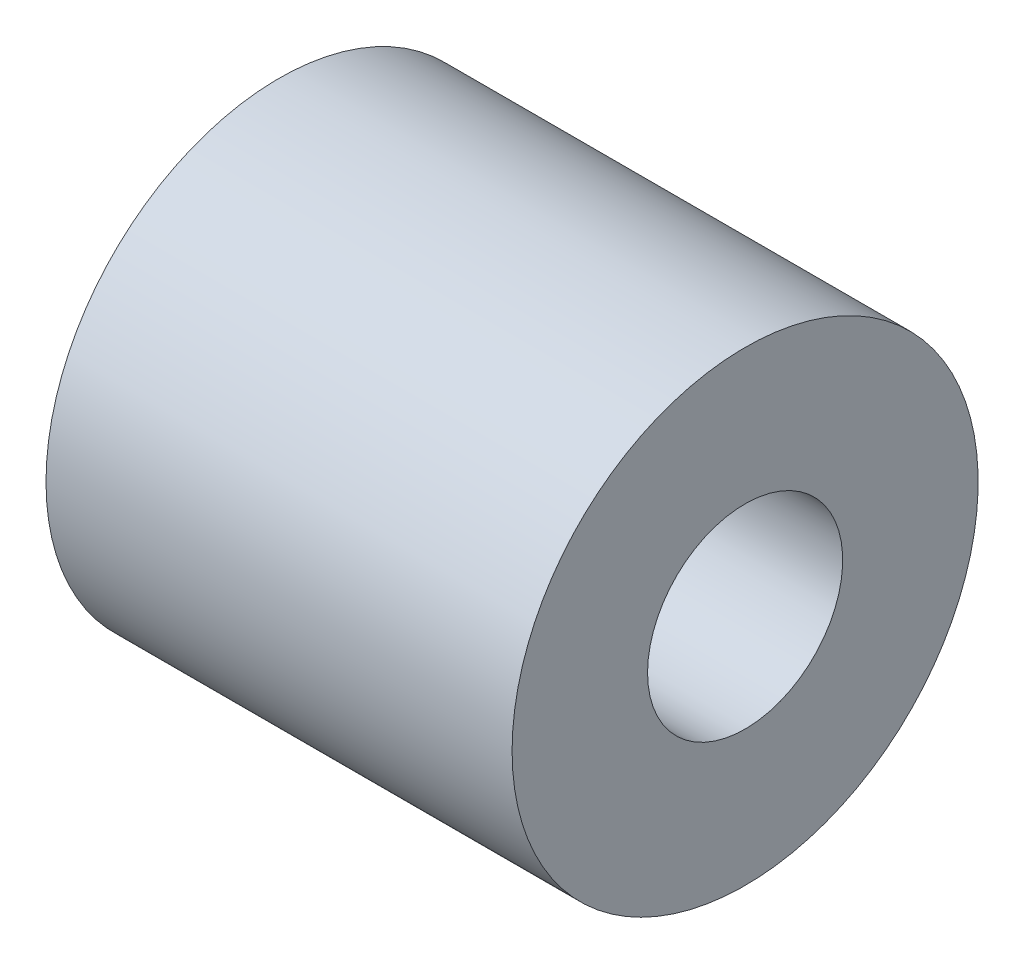
ISO-10303-21;
HEADER;
FILE_DESCRIPTION(('STEP AP214'),'2;1');
FILE_NAME('part.step','',(''),(''),'','','');
FILE_SCHEMA(('AUTOMOTIVE_DESIGN { 1 0 10303 214 1 1 1 1 }'));
ENDSEC;
DATA;
#1=APPLICATION_CONTEXT('core data for automotive mechanical design processes');
#2=APPLICATION_PROTOCOL_DEFINITION('international standard','automotive_design',2000,#1);
#3=PRODUCT_CONTEXT('',#1,'mechanical');
#4=PRODUCT('Part','Part','',(#3));
#5=PRODUCT_RELATED_PRODUCT_CATEGORY('part','',(#4));
#6=PRODUCT_DEFINITION_FORMATION('','',#4);
#7=PRODUCT_DEFINITION_CONTEXT('part definition',#1,'design');
#8=PRODUCT_DEFINITION('design','',#6,#7);
#9=PRODUCT_DEFINITION_SHAPE('','',#8);
#10=(LENGTH_UNIT() NAMED_UNIT(*) SI_UNIT(.MILLI.,.METRE.));
#11=(NAMED_UNIT(*) PLANE_ANGLE_UNIT() SI_UNIT($,.RADIAN.));
#12=(NAMED_UNIT(*) SI_UNIT($,.STERADIAN.) SOLID_ANGLE_UNIT());
#13=UNCERTAINTY_MEASURE_WITH_UNIT(LENGTH_MEASURE(1.E-05),#10,'distance_accuracy_value','');
#14=(GEOMETRIC_REPRESENTATION_CONTEXT(3) GLOBAL_UNCERTAINTY_ASSIGNED_CONTEXT((#13)) GLOBAL_UNIT_ASSIGNED_CONTEXT((#10,
#11,#12)) REPRESENTATION_CONTEXT('',''));
#15=CARTESIAN_POINT('',(0.,0.,0.));
#16=DIRECTION('',(0.,0.,1.));
#17=DIRECTION('',(1.,0.,0.));
#18=AXIS2_PLACEMENT_3D('',#15,#16,#17);
#19=CARTESIAN_POINT('',(4.7625,0.,0.));
#20=DIRECTION('',(1.,0.,0.));
#21=DIRECTION('',(0.,0.,-1.));
#22=AXIS2_PLACEMENT_3D('',#19,#20,#21);
#23=PLANE('',#22);
#24=CARTESIAN_POINT('',(4.7625,0.,0.));
#25=DIRECTION('',(1.,0.,0.));
#26=DIRECTION('',(0.,0.,-1.));
#27=AXIS2_PLACEMENT_3D('',#24,#25,#26);
#28=CIRCLE('',#27,4.7625);
#29=CARTESIAN_POINT('',(4.7625,0.,4.7625));
#30=VERTEX_POINT('',#29);
#31=EDGE_CURVE('E10',#30,#30,#28,.T.);
#32=ORIENTED_EDGE('',*,*,#31,.T.);
#33=EDGE_LOOP('',(#32));
#34=FACE_BOUND('',#33,.T.);
#35=CARTESIAN_POINT('',(4.7625,0.,0.));
#36=DIRECTION('',(1.,0.,0.));
#37=DIRECTION('',(0.,0.,-1.));
#38=AXIS2_PLACEMENT_3D('',#35,#36,#37);
#39=CIRCLE('',#38,1.9939);
#40=CARTESIAN_POINT('',(4.7625,0.,1.9939));
#41=VERTEX_POINT('',#40);
#42=EDGE_CURVE('E44',#41,#41,#39,.T.);
#43=ORIENTED_EDGE('',*,*,#42,.F.);
#44=EDGE_LOOP('',(#43));
#45=FACE_BOUND('',#44,.T.);
#46=ADVANCED_FACE('F33',(#34,#45),#23,.T.);
#47=CARTESIAN_POINT('',(-4.7625,0.,0.));
#48=DIRECTION('',(1.,0.,0.));
#49=DIRECTION('',(0.,0.,-1.));
#50=AXIS2_PLACEMENT_3D('',#47,#48,#49);
#51=PLANE('',#50);
#52=CARTESIAN_POINT('',(-4.7625,0.,0.));
#53=DIRECTION('',(1.,0.,0.));
#54=DIRECTION('',(0.,0.,-1.));
#55=AXIS2_PLACEMENT_3D('',#52,#53,#54);
#56=CIRCLE('',#55,4.7625);
#57=CARTESIAN_POINT('',(-4.7625,0.,4.7625));
#58=VERTEX_POINT('',#57);
#59=EDGE_CURVE('E37',#58,#58,#56,.T.);
#60=ORIENTED_EDGE('',*,*,#59,.F.);
#61=EDGE_LOOP('',(#60));
#62=FACE_BOUND('',#61,.T.);
#63=CARTESIAN_POINT('',(-4.7625,0.,0.));
#64=DIRECTION('',(1.,0.,0.));
#65=DIRECTION('',(0.,0.,-1.));
#66=AXIS2_PLACEMENT_3D('',#63,#64,#65);
#67=CIRCLE('',#66,1.9939);
#68=CARTESIAN_POINT('',(-4.7625,0.,1.9939));
#69=VERTEX_POINT('',#68);
#70=EDGE_CURVE('E46',#69,#69,#67,.T.);
#71=ORIENTED_EDGE('',*,*,#70,.T.);
#72=EDGE_LOOP('',(#71));
#73=FACE_BOUND('',#72,.T.);
#74=ADVANCED_FACE('F56',(#62,#73),#51,.F.);
#75=CARTESIAN_POINT('',(4.7625,0.,0.));
#76=DIRECTION('',(-1.,0.,0.));
#77=DIRECTION('',(0.,0.,1.));
#78=AXIS2_PLACEMENT_3D('',#75,#76,#77);
#79=CYLINDRICAL_SURFACE('',#78,4.7625);
#80=CARTESIAN_POINT('',(4.7625,0.,4.7625));
#81=CARTESIAN_POINT('',(4.66328125,0.,4.7625));
#82=CARTESIAN_POINT('',(4.5640625,0.,4.7625));
#83=CARTESIAN_POINT('',(4.365625,0.,4.7625));
#84=CARTESIAN_POINT('',(4.26640625,0.,4.7625));
#85=CARTESIAN_POINT('',(4.06796875,0.,4.7625));
#86=CARTESIAN_POINT('',(3.96875,0.,4.7625));
#87=CARTESIAN_POINT('',(3.7703125,0.,4.7625));
#88=CARTESIAN_POINT('',(3.67109375,0.,4.7625));
#89=CARTESIAN_POINT('',(3.47265625,0.,4.7625));
#90=CARTESIAN_POINT('',(3.3734375,0.,4.7625));
#91=CARTESIAN_POINT('',(3.175,0.,4.7625));
#92=CARTESIAN_POINT('',(3.07578125,0.,4.7625));
#93=CARTESIAN_POINT('',(2.87734375,0.,4.7625));
#94=CARTESIAN_POINT('',(2.778125,0.,4.7625));
#95=CARTESIAN_POINT('',(2.5796875,0.,4.7625));
#96=CARTESIAN_POINT('',(2.48046875,0.,4.7625));
#97=CARTESIAN_POINT('',(2.28203125,0.,4.7625));
#98=CARTESIAN_POINT('',(2.1828125,0.,4.7625));
#99=CARTESIAN_POINT('',(1.984375,0.,4.7625));
#100=CARTESIAN_POINT('',(1.88515625,0.,4.7625));
#101=CARTESIAN_POINT('',(1.68671875,0.,4.7625));
#102=CARTESIAN_POINT('',(1.5875,0.,4.7625));
#103=CARTESIAN_POINT('',(1.3890625,0.,4.7625));
#104=CARTESIAN_POINT('',(1.28984375,0.,4.7625));
#105=CARTESIAN_POINT('',(1.09140625,0.,4.7625));
#106=CARTESIAN_POINT('',(0.992187499999999,0.,4.7625));
#107=CARTESIAN_POINT('',(0.79375,0.,4.7625));
#108=CARTESIAN_POINT('',(0.69453125,0.,4.7625));
#109=CARTESIAN_POINT('',(0.49609375,0.,4.7625));
#110=CARTESIAN_POINT('',(0.396875,0.,4.7625));
#111=CARTESIAN_POINT('',(0.1984375,0.,4.7625));
#112=CARTESIAN_POINT('',(0.0992187500000001,0.,4.7625));
#113=CARTESIAN_POINT('',(-0.0992187500000001,0.,4.7625));
#114=CARTESIAN_POINT('',(-0.1984375,0.,4.7625));
#115=CARTESIAN_POINT('',(-0.396875,0.,4.7625));
#116=CARTESIAN_POINT('',(-0.49609375,0.,4.7625));
#117=CARTESIAN_POINT('',(-0.69453125,0.,4.7625));
#118=CARTESIAN_POINT('',(-0.793750000000001,0.,4.7625));
#119=CARTESIAN_POINT('',(-0.992187500000001,0.,4.7625));
#120=CARTESIAN_POINT('',(-1.09140625,0.,4.7625));
#121=CARTESIAN_POINT('',(-1.28984375,0.,4.7625));
#122=CARTESIAN_POINT('',(-1.3890625,0.,4.7625));
#123=CARTESIAN_POINT('',(-1.5875,0.,4.7625));
#124=CARTESIAN_POINT('',(-1.68671875,0.,4.7625));
#125=CARTESIAN_POINT('',(-1.88515625,0.,4.7625));
#126=CARTESIAN_POINT('',(-1.984375,0.,4.7625));
#127=CARTESIAN_POINT('',(-2.1828125,0.,4.7625));
#128=CARTESIAN_POINT('',(-2.28203125,0.,4.7625));
#129=CARTESIAN_POINT('',(-2.48046875,0.,4.7625));
#130=CARTESIAN_POINT('',(-2.5796875,0.,4.7625));
#131=CARTESIAN_POINT('',(-2.778125,0.,4.7625));
#132=CARTESIAN_POINT('',(-2.87734375,0.,4.7625));
#133=CARTESIAN_POINT('',(-3.07578125,0.,4.7625));
#134=CARTESIAN_POINT('',(-3.175,0.,4.7625));
#135=CARTESIAN_POINT('',(-3.3734375,0.,4.7625));
#136=CARTESIAN_POINT('',(-3.47265625,0.,4.7625));
#137=CARTESIAN_POINT('',(-3.67109375,0.,4.7625));
#138=CARTESIAN_POINT('',(-3.7703125,0.,4.7625));
#139=CARTESIAN_POINT('',(-3.96875,0.,4.7625));
#140=CARTESIAN_POINT('',(-4.06796875,0.,4.7625));
#141=CARTESIAN_POINT('',(-4.26640625,0.,4.7625));
#142=CARTESIAN_POINT('',(-4.365625,0.,4.7625));
#143=CARTESIAN_POINT('',(-4.5640625,0.,4.7625));
#144=CARTESIAN_POINT('',(-4.66328125,0.,4.7625));
#145=CARTESIAN_POINT('',(-4.7625,0.,4.7625));
#146=B_SPLINE_CURVE_WITH_KNOTS('',3,(#80,#81,#82,#83,#84,#85,#86,#87,#88,#89,#90,#91,#92,#93,
#94,#95,#96,#97,#98,#99,#100,#101,#102,#103,#104,#105,#106,#107,#108,#109,#110,#111,#112,#113,
#114,#115,#116,#117,#118,#119,#120,#121,#122,#123,#124,#125,#126,#127,#128,#129,#130,#131,#132,
#133,#134,#135,#136,#137,#138,#139,#140,#141,#142,#143,#144,#145),.UNSPECIFIED.,.F.,.F.,(4,2,2,
2,2,2,2,2,2,2,2,2,2,2,2,2,2,2,2,2,2,2,2,2,2,2,2,2,2,2,2,2,4),(0.,0.29765625,0.5953125,
0.892968750000001,1.190625,1.48828125,1.7859375,2.08359375,2.38125,2.67890625,2.9765625,
3.27421875,3.571875,3.86953125,4.1671875,4.46484375,4.7625,5.06015625,5.3578125,5.65546875,
5.953125,6.25078125,6.5484375,6.84609375,7.14375,7.44140625,7.7390625,8.03671875,8.334375,
8.63203125,8.9296875,9.22734375,9.525),.UNSPECIFIED.);
#147=EDGE_CURVE('BSEAM35',#30,#58,#146,.T.);
#148=ORIENTED_EDGE('',*,*,#31,.F.);
#149=ORIENTED_EDGE('',*,*,#59,.T.);
#150=ORIENTED_EDGE('',*,*,#147,.T.);
#151=ORIENTED_EDGE('',*,*,#147,.F.);
#152=EDGE_LOOP('',(#148,#150,#149,#151));
#153=FACE_BOUND('',#152,.T.);
#154=ADVANCED_FACE('F35',(#153),#79,.T.);
#155=CARTESIAN_POINT('',(4.7625,0.,0.));
#156=DIRECTION('',(-1.,0.,0.));
#157=DIRECTION('',(0.,0.,1.));
#158=AXIS2_PLACEMENT_3D('',#155,#156,#157);
#159=CYLINDRICAL_SURFACE('',#158,1.9939);
#160=CARTESIAN_POINT('',(4.7625,0.,1.9939));
#161=CARTESIAN_POINT('',(4.66328125,0.,1.9939));
#162=CARTESIAN_POINT('',(4.5640625,0.,1.9939));
#163=CARTESIAN_POINT('',(4.365625,0.,1.9939));
#164=CARTESIAN_POINT('',(4.26640625,0.,1.9939));
#165=CARTESIAN_POINT('',(4.06796875,0.,1.9939));
#166=CARTESIAN_POINT('',(3.96875,0.,1.9939));
#167=CARTESIAN_POINT('',(3.7703125,0.,1.9939));
#168=CARTESIAN_POINT('',(3.67109375,0.,1.9939));
#169=CARTESIAN_POINT('',(3.47265625,0.,1.9939));
#170=CARTESIAN_POINT('',(3.3734375,0.,1.9939));
#171=CARTESIAN_POINT('',(3.175,0.,1.9939));
#172=CARTESIAN_POINT('',(3.07578125,0.,1.9939));
#173=CARTESIAN_POINT('',(2.87734375,0.,1.9939));
#174=CARTESIAN_POINT('',(2.778125,0.,1.9939));
#175=CARTESIAN_POINT('',(2.5796875,0.,1.9939));
#176=CARTESIAN_POINT('',(2.48046875,0.,1.9939));
#177=CARTESIAN_POINT('',(2.28203125,0.,1.9939));
#178=CARTESIAN_POINT('',(2.1828125,0.,1.9939));
#179=CARTESIAN_POINT('',(1.984375,0.,1.9939));
#180=CARTESIAN_POINT('',(1.88515625,0.,1.9939));
#181=CARTESIAN_POINT('',(1.68671875,0.,1.9939));
#182=CARTESIAN_POINT('',(1.5875,0.,1.9939));
#183=CARTESIAN_POINT('',(1.3890625,0.,1.9939));
#184=CARTESIAN_POINT('',(1.28984375,0.,1.9939));
#185=CARTESIAN_POINT('',(1.09140625,0.,1.9939));
#186=CARTESIAN_POINT('',(0.992187499999999,0.,1.9939));
#187=CARTESIAN_POINT('',(0.79375,0.,1.9939));
#188=CARTESIAN_POINT('',(0.69453125,0.,1.9939));
#189=CARTESIAN_POINT('',(0.49609375,0.,1.9939));
#190=CARTESIAN_POINT('',(0.396875,0.,1.9939));
#191=CARTESIAN_POINT('',(0.1984375,0.,1.9939));
#192=CARTESIAN_POINT('',(0.0992187500000001,0.,1.9939));
#193=CARTESIAN_POINT('',(-0.0992187500000001,0.,1.9939));
#194=CARTESIAN_POINT('',(-0.1984375,0.,1.9939));
#195=CARTESIAN_POINT('',(-0.396875,0.,1.9939));
#196=CARTESIAN_POINT('',(-0.49609375,0.,1.9939));
#197=CARTESIAN_POINT('',(-0.69453125,0.,1.9939));
#198=CARTESIAN_POINT('',(-0.793750000000001,0.,1.9939));
#199=CARTESIAN_POINT('',(-0.992187500000001,0.,1.9939));
#200=CARTESIAN_POINT('',(-1.09140625,0.,1.9939));
#201=CARTESIAN_POINT('',(-1.28984375,0.,1.9939));
#202=CARTESIAN_POINT('',(-1.3890625,0.,1.9939));
#203=CARTESIAN_POINT('',(-1.5875,0.,1.9939));
#204=CARTESIAN_POINT('',(-1.68671875,0.,1.9939));
#205=CARTESIAN_POINT('',(-1.88515625,0.,1.9939));
#206=CARTESIAN_POINT('',(-1.984375,0.,1.9939));
#207=CARTESIAN_POINT('',(-2.1828125,0.,1.9939));
#208=CARTESIAN_POINT('',(-2.28203125,0.,1.9939));
#209=CARTESIAN_POINT('',(-2.48046875,0.,1.9939));
#210=CARTESIAN_POINT('',(-2.5796875,0.,1.9939));
#211=CARTESIAN_POINT('',(-2.778125,0.,1.9939));
#212=CARTESIAN_POINT('',(-2.87734375,0.,1.9939));
#213=CARTESIAN_POINT('',(-3.07578125,0.,1.9939));
#214=CARTESIAN_POINT('',(-3.175,0.,1.9939));
#215=CARTESIAN_POINT('',(-3.3734375,0.,1.9939));
#216=CARTESIAN_POINT('',(-3.47265625,0.,1.9939));
#217=CARTESIAN_POINT('',(-3.67109375,0.,1.9939));
#218=CARTESIAN_POINT('',(-3.7703125,0.,1.9939));
#219=CARTESIAN_POINT('',(-3.96875,0.,1.9939));
#220=CARTESIAN_POINT('',(-4.06796875,0.,1.9939));
#221=CARTESIAN_POINT('',(-4.26640625,0.,1.9939));
#222=CARTESIAN_POINT('',(-4.365625,0.,1.9939));
#223=CARTESIAN_POINT('',(-4.5640625,0.,1.9939));
#224=CARTESIAN_POINT('',(-4.66328125,0.,1.9939));
#225=CARTESIAN_POINT('',(-4.7625,0.,1.9939));
#226=B_SPLINE_CURVE_WITH_KNOTS('',3,(#160,#161,#162,#163,#164,#165,#166,#167,#168,#169,#170,
#171,#172,#173,#174,#175,#176,#177,#178,#179,#180,#181,#182,#183,#184,#185,#186,#187,#188,#189,
#190,#191,#192,#193,#194,#195,#196,#197,#198,#199,#200,#201,#202,#203,#204,#205,#206,#207,#208,
#209,#210,#211,#212,#213,#214,#215,#216,#217,#218,#219,#220,#221,#222,#223,#224,#225),
.UNSPECIFIED.,.F.,.F.,(4,2,2,2,2,2,2,2,2,2,2,2,2,2,2,2,2,2,2,2,2,2,2,2,2,2,2,2,2,2,2,2,4),(0.,
0.29765625,0.5953125,0.892968750000001,1.190625,1.48828125,1.7859375,2.08359375,2.38125,
2.67890625,2.9765625,3.27421875,3.571875,3.86953125,4.1671875,4.46484375,4.7625,5.06015625,
5.3578125,5.65546875,5.953125,6.25078125,6.5484375,6.84609375,7.14375,7.44140625,7.7390625,
8.03671875,8.334375,8.63203125,8.9296875,9.22734375,9.525),.UNSPECIFIED.);
#227=EDGE_CURVE('BSEAM52',#41,#69,#226,.T.);
#228=ORIENTED_EDGE('',*,*,#42,.T.);
#229=ORIENTED_EDGE('',*,*,#70,.F.);
#230=ORIENTED_EDGE('',*,*,#227,.T.);
#231=ORIENTED_EDGE('',*,*,#227,.F.);
#232=EDGE_LOOP('',(#228,#230,#229,#231));
#233=FACE_BOUND('',#232,.T.);
#234=ADVANCED_FACE('F52',(#233),#159,.F.);
#235=CLOSED_SHELL('',(#46,#74,#154,#234));
#236=MANIFOLD_SOLID_BREP('B2',#235);
#237=ADVANCED_BREP_SHAPE_REPRESENTATION('',(#18,#236),#14);
#238=SHAPE_DEFINITION_REPRESENTATION(#9,#237);
ENDSEC;
END-ISO-10303-21;
